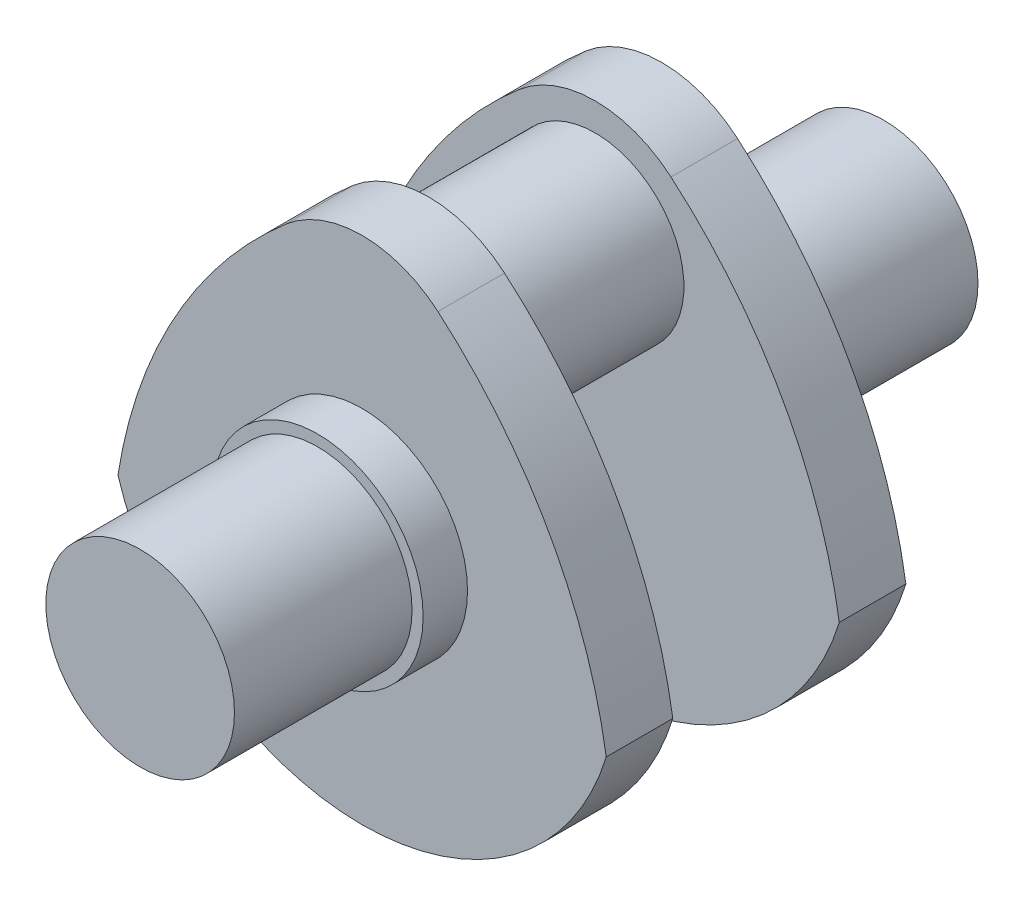
ISO-10303-21;
HEADER;
FILE_DESCRIPTION(('STEP AP214'),'2;1');
FILE_NAME('part.step','',(''),(''),'','','');
FILE_SCHEMA(('AUTOMOTIVE_DESIGN { 1 0 10303 214 1 1 1 1 }'));
ENDSEC;
DATA;
#1=APPLICATION_CONTEXT('core data for automotive mechanical design processes');
#2=APPLICATION_PROTOCOL_DEFINITION('international standard','automotive_design',2000,#1);
#3=PRODUCT_CONTEXT('',#1,'mechanical');
#4=PRODUCT('Part','Part','',(#3));
#5=PRODUCT_RELATED_PRODUCT_CATEGORY('part','',(#4));
#6=PRODUCT_DEFINITION_FORMATION('','',#4);
#7=PRODUCT_DEFINITION_CONTEXT('part definition',#1,'design');
#8=PRODUCT_DEFINITION('design','',#6,#7);
#9=PRODUCT_DEFINITION_SHAPE('','',#8);
#10=(LENGTH_UNIT() NAMED_UNIT(*) SI_UNIT(.MILLI.,.METRE.));
#11=(NAMED_UNIT(*) PLANE_ANGLE_UNIT() SI_UNIT($,.RADIAN.));
#12=(NAMED_UNIT(*) SI_UNIT($,.STERADIAN.) SOLID_ANGLE_UNIT());
#13=UNCERTAINTY_MEASURE_WITH_UNIT(LENGTH_MEASURE(1.E-05),#10,'distance_accuracy_value','');
#14=(GEOMETRIC_REPRESENTATION_CONTEXT(3) GLOBAL_UNCERTAINTY_ASSIGNED_CONTEXT((#13)) GLOBAL_UNIT_ASSIGNED_CONTEXT((#10,
#11,#12)) REPRESENTATION_CONTEXT('',''));
#15=CARTESIAN_POINT('',(0.,0.,0.));
#16=DIRECTION('',(0.,0.,1.));
#17=DIRECTION('',(1.,0.,0.));
#18=AXIS2_PLACEMENT_3D('',#15,#16,#17);
#19=CARTESIAN_POINT('',(0.,0.,40.));
#20=DIRECTION('',(0.,0.,-1.));
#21=DIRECTION('',(-1.,0.,0.));
#22=AXIS2_PLACEMENT_3D('',#19,#20,#21);
#23=CYLINDRICAL_SURFACE('',#22,17.);
#24=CARTESIAN_POINT('',(0.,0.,0.));
#25=DIRECTION('',(0.,0.,1.));
#26=DIRECTION('',(1.,0.,0.));
#27=AXIS2_PLACEMENT_3D('',#24,#25,#26);
#28=CIRCLE('',#27,17.);
#29=CARTESIAN_POINT('',(17.,0.,0.));
#30=VERTEX_POINT('',#29);
#31=EDGE_CURVE('E191',#30,#30,#28,.T.);
#32=ORIENTED_EDGE('',*,*,#31,.T.);
#33=EDGE_LOOP('',(#32));
#34=FACE_BOUND('',#33,.T.);
#35=CARTESIAN_POINT('',(0.,0.,32.));
#36=DIRECTION('',(0.,0.,1.));
#37=DIRECTION('',(1.,0.,0.));
#38=AXIS2_PLACEMENT_3D('',#35,#36,#37);
#39=CIRCLE('',#38,17.);
#40=CARTESIAN_POINT('',(17.,0.,32.));
#41=VERTEX_POINT('',#40);
#42=EDGE_CURVE('E41',#41,#41,#39,.T.);
#43=ORIENTED_EDGE('',*,*,#42,.F.);
#44=EDGE_LOOP('',(#43));
#45=FACE_BOUND('',#44,.T.);
#46=ADVANCED_FACE('F33',(#34,#45),#23,.T.);
#47=CARTESIAN_POINT('',(0.,0.,0.));
#48=DIRECTION('',(0.,0.,1.));
#49=DIRECTION('',(1.,0.,0.));
#50=AXIS2_PLACEMENT_3D('',#47,#48,#49);
#51=PLANE('',#50);
#52=ORIENTED_EDGE('',*,*,#31,.F.);
#53=EDGE_LOOP('',(#52));
#54=FACE_BOUND('',#53,.T.);
#55=ADVANCED_FACE('F202',(#54),#51,.F.);
#56=CARTESIAN_POINT('',(0.,0.,32.));
#57=DIRECTION('',(0.,0.,1.));
#58=DIRECTION('',(1.,0.,0.));
#59=AXIS2_PLACEMENT_3D('',#56,#57,#58);
#60=CYLINDRICAL_SURFACE('',#59,19.);
#61=CARTESIAN_POINT('',(0.,0.,32.));
#62=DIRECTION('',(0.,0.,1.));
#63=DIRECTION('',(1.,0.,0.));
#64=AXIS2_PLACEMENT_3D('',#61,#62,#63);
#65=CIRCLE('',#64,19.);
#66=CARTESIAN_POINT('',(19.,0.,32.));
#67=VERTEX_POINT('',#66);
#68=EDGE_CURVE('E188',#67,#67,#65,.T.);
#69=ORIENTED_EDGE('',*,*,#68,.T.);
#70=EDGE_LOOP('',(#69));
#71=FACE_BOUND('',#70,.T.);
#72=CARTESIAN_POINT('',(0.,0.,40.));
#73=DIRECTION('',(0.,0.,1.));
#74=DIRECTION('',(1.,0.,0.));
#75=AXIS2_PLACEMENT_3D('',#72,#73,#74);
#76=CIRCLE('',#75,19.);
#77=CARTESIAN_POINT('',(19.,0.,40.));
#78=VERTEX_POINT('',#77);
#79=EDGE_CURVE('E187',#78,#78,#76,.T.);
#80=ORIENTED_EDGE('',*,*,#79,.F.);
#81=EDGE_LOOP('',(#80));
#82=FACE_BOUND('',#81,.T.);
#83=ADVANCED_FACE('F207',(#71,#82),#60,.T.);
#84=CARTESIAN_POINT('',(0.,0.,32.));
#85=DIRECTION('',(0.,0.,1.));
#86=DIRECTION('',(1.,0.,0.));
#87=AXIS2_PLACEMENT_3D('',#84,#85,#86);
#88=PLANE('',#87);
#89=ORIENTED_EDGE('',*,*,#42,.T.);
#90=EDGE_LOOP('',(#89));
#91=FACE_BOUND('',#90,.T.);
#92=ORIENTED_EDGE('',*,*,#68,.F.);
#93=EDGE_LOOP('',(#92));
#94=FACE_BOUND('',#93,.T.);
#95=ADVANCED_FACE('F198',(#91,#94),#88,.F.);
#96=CARTESIAN_POINT('',(44.9094542035734,-27.3845485151599,52.));
#97=DIRECTION('',(0.,0.,-1.));
#98=DIRECTION('',(-1.,0.,0.));
#99=AXIS2_PLACEMENT_3D('',#96,#97,#98);
#100=CYLINDRICAL_SURFACE('',#99,90.);
#101=CARTESIAN_POINT('',(44.9094542035734,-27.3845485151599,40.));
#102=DIRECTION('',(0.,0.,1.));
#103=DIRECTION('',(-1.,0.,0.));
#104=AXIS2_PLACEMENT_3D('',#101,#102,#103);
#105=CIRCLE('',#104,90.);
#106=CARTESIAN_POINT('',(-13.6680947576093,40.9431234611356,40.));
#107=VERTEX_POINT('',#106);
#108=CARTESIAN_POINT('',(-44.,-13.4164078649987,40.));
#109=VERTEX_POINT('',#108);
#110=EDGE_CURVE('E166',#107,#109,#105,.T.);
#111=ORIENTED_EDGE('',*,*,#110,.T.);
#112=DIRECTION('',(0.,0.,-1.));
#113=VECTOR('',#112,1.);
#114=CARTESIAN_POINT('',(-44.,-13.4164078649987,52.));
#115=LINE('',#114,#113);
#116=CARTESIAN_POINT('',(-44.,-13.4164078649987,52.));
#117=VERTEX_POINT('',#116);
#118=EDGE_CURVE('E185',#117,#109,#115,.T.);
#119=ORIENTED_EDGE('',*,*,#118,.F.);
#120=CARTESIAN_POINT('',(44.9094542035734,-27.3845485151599,52.));
#121=DIRECTION('',(0.,0.,1.));
#122=DIRECTION('',(-1.,0.,0.));
#123=AXIS2_PLACEMENT_3D('',#120,#121,#122);
#124=CIRCLE('',#123,90.);
#125=CARTESIAN_POINT('',(-13.6680947576093,40.9431234611356,52.));
#126=VERTEX_POINT('',#125);
#127=EDGE_CURVE('E167',#126,#117,#124,.T.);
#128=ORIENTED_EDGE('',*,*,#127,.F.);
#129=DIRECTION('',(0.,0.,-1.));
#130=VECTOR('',#129,1.);
#131=CARTESIAN_POINT('',(-13.6680947576093,40.9431234611356,52.));
#132=LINE('',#131,#130);
#133=EDGE_CURVE('E173',#126,#107,#132,.T.);
#134=ORIENTED_EDGE('',*,*,#133,.T.);
#135=EDGE_LOOP('',(#111,#119,#128,#134));
#136=FACE_BOUND('',#135,.T.);
#137=ADVANCED_FACE('F218',(#136),#100,.T.);
#138=CARTESIAN_POINT('',(0.,0.,52.));
#139=DIRECTION('',(0.,0.,-1.));
#140=DIRECTION('',(-1.,0.,0.));
#141=AXIS2_PLACEMENT_3D('',#138,#139,#140);
#142=CYLINDRICAL_SURFACE('',#141,46.);
#143=CARTESIAN_POINT('',(0.,0.,40.));
#144=DIRECTION('',(0.,0.,1.));
#145=DIRECTION('',(1.,0.,0.));
#146=AXIS2_PLACEMENT_3D('',#143,#144,#145);
#147=CIRCLE('',#146,46.);
#148=CARTESIAN_POINT('',(44.,-13.4164078649987,40.));
#149=VERTEX_POINT('',#148);
#150=EDGE_CURVE('E176',#109,#149,#147,.T.);
#151=ORIENTED_EDGE('',*,*,#150,.T.);
#152=DIRECTION('',(0.,0.,-1.));
#153=VECTOR('',#152,1.);
#154=CARTESIAN_POINT('',(44.,-13.4164078649987,52.));
#155=LINE('',#154,#153);
#156=CARTESIAN_POINT('',(44.,-13.4164078649987,52.));
#157=VERTEX_POINT('',#156);
#158=EDGE_CURVE('E183',#157,#149,#155,.T.);
#159=ORIENTED_EDGE('',*,*,#158,.F.);
#160=CARTESIAN_POINT('',(0.,0.,52.));
#161=DIRECTION('',(0.,0.,1.));
#162=DIRECTION('',(1.,0.,0.));
#163=AXIS2_PLACEMENT_3D('',#160,#161,#162);
#164=CIRCLE('',#163,46.);
#165=EDGE_CURVE('E81',#117,#157,#164,.T.);
#166=ORIENTED_EDGE('',*,*,#165,.F.);
#167=ORIENTED_EDGE('',*,*,#118,.T.);
#168=EDGE_LOOP('',(#151,#159,#166,#167));
#169=FACE_BOUND('',#168,.T.);
#170=ADVANCED_FACE('F221',(#169),#142,.T.);
#171=CARTESIAN_POINT('',(-44.9094542035734,-27.3845485151599,52.));
#172=DIRECTION('',(0.,0.,-1.));
#173=DIRECTION('',(-1.,0.,0.));
#174=AXIS2_PLACEMENT_3D('',#171,#172,#173);
#175=CYLINDRICAL_SURFACE('',#174,90.);
#176=CARTESIAN_POINT('',(-44.9094542035734,-27.3845485151599,40.));
#177=DIRECTION('',(0.,0.,1.));
#178=DIRECTION('',(1.,0.,0.));
#179=AXIS2_PLACEMENT_3D('',#176,#177,#178);
#180=CIRCLE('',#179,90.);
#181=CARTESIAN_POINT('',(13.6680947576093,40.9431234611356,40.));
#182=VERTEX_POINT('',#181);
#183=EDGE_CURVE('E67',#149,#182,#180,.T.);
#184=ORIENTED_EDGE('',*,*,#183,.T.);
#185=DIRECTION('',(0.,0.,-1.));
#186=VECTOR('',#185,1.);
#187=CARTESIAN_POINT('',(13.6680947576093,40.9431234611356,52.));
#188=LINE('',#187,#186);
#189=CARTESIAN_POINT('',(13.6680947576093,40.9431234611356,52.));
#190=VERTEX_POINT('',#189);
#191=EDGE_CURVE('E181',#190,#182,#188,.T.);
#192=ORIENTED_EDGE('',*,*,#191,.F.);
#193=CARTESIAN_POINT('',(-44.9094542035734,-27.3845485151599,52.));
#194=DIRECTION('',(0.,0.,1.));
#195=DIRECTION('',(1.,0.,0.));
#196=AXIS2_PLACEMENT_3D('',#193,#194,#195);
#197=CIRCLE('',#196,90.);
#198=EDGE_CURVE('E170',#157,#190,#197,.T.);
#199=ORIENTED_EDGE('',*,*,#198,.F.);
#200=ORIENTED_EDGE('',*,*,#158,.T.);
#201=EDGE_LOOP('',(#184,#192,#199,#200));
#202=FACE_BOUND('',#201,.T.);
#203=ADVANCED_FACE('F225',(#202),#175,.T.);
#204=CARTESIAN_POINT('',(0.,25.,52.));
#205=DIRECTION('',(0.,0.,-1.));
#206=DIRECTION('',(-1.,0.,0.));
#207=AXIS2_PLACEMENT_3D('',#204,#205,#206);
#208=CYLINDRICAL_SURFACE('',#207,21.);
#209=CARTESIAN_POINT('',(0.,25.,40.));
#210=DIRECTION('',(0.,0.,1.));
#211=DIRECTION('',(1.,0.,0.));
#212=AXIS2_PLACEMENT_3D('',#209,#210,#211);
#213=CIRCLE('',#212,21.);
#214=EDGE_CURVE('E73',#182,#107,#213,.T.);
#215=ORIENTED_EDGE('',*,*,#214,.T.);
#216=ORIENTED_EDGE('',*,*,#133,.F.);
#217=CARTESIAN_POINT('',(0.,25.,52.));
#218=DIRECTION('',(0.,0.,1.));
#219=DIRECTION('',(1.,0.,0.));
#220=AXIS2_PLACEMENT_3D('',#217,#218,#219);
#221=CIRCLE('',#220,21.);
#222=EDGE_CURVE('E49',#190,#126,#221,.T.);
#223=ORIENTED_EDGE('',*,*,#222,.F.);
#224=ORIENTED_EDGE('',*,*,#191,.T.);
#225=EDGE_LOOP('',(#215,#216,#223,#224));
#226=FACE_BOUND('',#225,.T.);
#227=ADVANCED_FACE('F228',(#226),#208,.T.);
#228=CARTESIAN_POINT('',(22.4547271017867,-1.19227425757995,52.));
#229=DIRECTION('',(0.,0.,-1.));
#230=DIRECTION('',(-1.,0.,0.));
#231=AXIS2_PLACEMENT_3D('',#228,#229,#230);
#232=PLANE('',#231);
#233=CARTESIAN_POINT('',(0.,25.,52.));
#234=DIRECTION('',(0.,0.,-1.));
#235=DIRECTION('',(-1.,0.,0.));
#236=AXIS2_PLACEMENT_3D('',#233,#234,#235);
#237=CIRCLE('',#236,16.);
#238=CARTESIAN_POINT('',(-16.,25.,52.));
#239=VERTEX_POINT('',#238);
#240=EDGE_CURVE('E11',#239,#239,#237,.F.);
#241=ORIENTED_EDGE('',*,*,#240,.F.);
#242=EDGE_LOOP('',(#241));
#243=FACE_BOUND('',#242,.T.);
#244=ORIENTED_EDGE('',*,*,#127,.T.);
#245=ORIENTED_EDGE('',*,*,#165,.T.);
#246=ORIENTED_EDGE('',*,*,#198,.T.);
#247=ORIENTED_EDGE('',*,*,#222,.T.);
#248=EDGE_LOOP('',(#244,#245,#246,#247));
#249=FACE_BOUND('',#248,.T.);
#250=ADVANCED_FACE('F231',(#243,#249),#232,.F.);
#251=CARTESIAN_POINT('',(22.4547271017867,-1.19227425757995,40.));
#252=DIRECTION('',(0.,0.,-1.));
#253=DIRECTION('',(-1.,0.,0.));
#254=AXIS2_PLACEMENT_3D('',#251,#252,#253);
#255=PLANE('',#254);
#256=ORIENTED_EDGE('',*,*,#79,.T.);
#257=EDGE_LOOP('',(#256));
#258=FACE_BOUND('',#257,.T.);
#259=ORIENTED_EDGE('',*,*,#110,.F.);
#260=ORIENTED_EDGE('',*,*,#214,.F.);
#261=ORIENTED_EDGE('',*,*,#183,.F.);
#262=ORIENTED_EDGE('',*,*,#150,.F.);
#263=EDGE_LOOP('',(#259,#260,#261,#262));
#264=FACE_BOUND('',#263,.T.);
#265=ADVANCED_FACE('F232',(#258,#264),#255,.T.);
#266=CARTESIAN_POINT('',(0.,25.,67.));
#267=DIRECTION('',(0.,0.,-1.));
#268=DIRECTION('',(-1.,0.,0.));
#269=AXIS2_PLACEMENT_3D('',#266,#267,#268);
#270=CYLINDRICAL_SURFACE('',#269,16.);
#271=ORIENTED_EDGE('',*,*,#240,.T.);
#272=EDGE_LOOP('',(#271));
#273=FACE_BOUND('',#272,.T.);
#274=CARTESIAN_POINT('',(0.,25.,82.));
#275=DIRECTION('',(0.,0.,-1.));
#276=DIRECTION('',(-1.,0.,0.));
#277=AXIS2_PLACEMENT_3D('',#274,#275,#276);
#278=CIRCLE('',#277,16.);
#279=CARTESIAN_POINT('',(-16.,25.,82.));
#280=VERTEX_POINT('',#279);
#281=EDGE_CURVE('E163',#280,#280,#278,.F.);
#282=ORIENTED_EDGE('',*,*,#281,.F.);
#283=EDGE_LOOP('',(#282));
#284=FACE_BOUND('',#283,.T.);
#285=ADVANCED_FACE('F235',(#273,#284),#270,.T.);
#286=CARTESIAN_POINT('',(0.,0.,94.));
#287=DIRECTION('',(0.,0.,1.));
#288=DIRECTION('',(-1.,0.,0.));
#289=AXIS2_PLACEMENT_3D('',#286,#287,#288);
#290=CYLINDRICAL_SURFACE('',#289,17.);
#291=CARTESIAN_POINT('',(0.,0.,134.));
#292=DIRECTION('',(0.,0.,1.));
#293=DIRECTION('',(1.,0.,0.));
#294=AXIS2_PLACEMENT_3D('',#291,#292,#293);
#295=CIRCLE('',#294,17.);
#296=CARTESIAN_POINT('',(17.,0.,134.));
#297=VERTEX_POINT('',#296);
#298=EDGE_CURVE('E155',#297,#297,#295,.T.);
#299=ORIENTED_EDGE('',*,*,#298,.F.);
#300=EDGE_LOOP('',(#299));
#301=FACE_BOUND('',#300,.T.);
#302=CARTESIAN_POINT('',(0.,0.,102.));
#303=DIRECTION('',(0.,0.,1.));
#304=DIRECTION('',(1.,0.,0.));
#305=AXIS2_PLACEMENT_3D('',#302,#303,#304);
#306=CIRCLE('',#305,17.);
#307=CARTESIAN_POINT('',(17.,0.,102.));
#308=VERTEX_POINT('',#307);
#309=EDGE_CURVE('E160',#308,#308,#306,.T.);
#310=ORIENTED_EDGE('',*,*,#309,.T.);
#311=EDGE_LOOP('',(#310));
#312=FACE_BOUND('',#311,.T.);
#313=ADVANCED_FACE('F242',(#301,#312),#290,.T.);
#314=CARTESIAN_POINT('',(0.,0.,134.));
#315=DIRECTION('',(0.,0.,-1.));
#316=DIRECTION('',(1.,0.,0.));
#317=AXIS2_PLACEMENT_3D('',#314,#315,#316);
#318=PLANE('',#317);
#319=ORIENTED_EDGE('',*,*,#298,.T.);
#320=EDGE_LOOP('',(#319));
#321=FACE_BOUND('',#320,.T.);
#322=ADVANCED_FACE('F246',(#321),#318,.F.);
#323=CARTESIAN_POINT('',(0.,0.,102.));
#324=DIRECTION('',(0.,0.,-1.));
#325=DIRECTION('',(1.,0.,0.));
#326=AXIS2_PLACEMENT_3D('',#323,#324,#325);
#327=CYLINDRICAL_SURFACE('',#326,19.);
#328=CARTESIAN_POINT('',(0.,0.,102.));
#329=DIRECTION('',(0.,0.,1.));
#330=DIRECTION('',(1.,0.,0.));
#331=AXIS2_PLACEMENT_3D('',#328,#329,#330);
#332=CIRCLE('',#331,19.);
#333=CARTESIAN_POINT('',(19.,0.,102.));
#334=VERTEX_POINT('',#333);
#335=EDGE_CURVE('E152',#334,#334,#332,.T.);
#336=ORIENTED_EDGE('',*,*,#335,.F.);
#337=EDGE_LOOP('',(#336));
#338=FACE_BOUND('',#337,.T.);
#339=CARTESIAN_POINT('',(0.,0.,94.));
#340=DIRECTION('',(0.,0.,1.));
#341=DIRECTION('',(1.,0.,0.));
#342=AXIS2_PLACEMENT_3D('',#339,#340,#341);
#343=CIRCLE('',#342,19.);
#344=CARTESIAN_POINT('',(19.,0.,94.));
#345=VERTEX_POINT('',#344);
#346=EDGE_CURVE('E128',#345,#345,#343,.T.);
#347=ORIENTED_EDGE('',*,*,#346,.T.);
#348=EDGE_LOOP('',(#347));
#349=FACE_BOUND('',#348,.T.);
#350=ADVANCED_FACE('F250',(#338,#349),#327,.T.);
#351=CARTESIAN_POINT('',(0.,0.,102.));
#352=DIRECTION('',(0.,0.,-1.));
#353=DIRECTION('',(1.,0.,0.));
#354=AXIS2_PLACEMENT_3D('',#351,#352,#353);
#355=PLANE('',#354);
#356=ORIENTED_EDGE('',*,*,#309,.F.);
#357=EDGE_LOOP('',(#356));
#358=FACE_BOUND('',#357,.T.);
#359=ORIENTED_EDGE('',*,*,#335,.T.);
#360=EDGE_LOOP('',(#359));
#361=FACE_BOUND('',#360,.T.);
#362=ADVANCED_FACE('F254',(#358,#361),#355,.F.);
#363=CARTESIAN_POINT('',(44.9094542035734,-27.3845485151599,82.));
#364=DIRECTION('',(0.,0.,1.));
#365=DIRECTION('',(-1.,0.,0.));
#366=AXIS2_PLACEMENT_3D('',#363,#364,#365);
#367=CYLINDRICAL_SURFACE('',#366,90.);
#368=CARTESIAN_POINT('',(44.9094542035734,-27.3845485151599,94.));
#369=DIRECTION('',(0.,0.,1.));
#370=DIRECTION('',(-1.,0.,0.));
#371=AXIS2_PLACEMENT_3D('',#368,#369,#370);
#372=CIRCLE('',#371,90.);
#373=CARTESIAN_POINT('',(-13.6680947576093,40.9431234611356,94.));
#374=VERTEX_POINT('',#373);
#375=CARTESIAN_POINT('',(-44.,-13.4164078649987,94.));
#376=VERTEX_POINT('',#375);
#377=EDGE_CURVE('E142',#374,#376,#372,.T.);
#378=ORIENTED_EDGE('',*,*,#377,.F.);
#379=DIRECTION('',(0.,0.,1.));
#380=VECTOR('',#379,1.);
#381=CARTESIAN_POINT('',(-13.6680947576093,40.9431234611356,82.));
#382=LINE('',#381,#380);
#383=CARTESIAN_POINT('',(-13.6680947576093,40.9431234611356,82.));
#384=VERTEX_POINT('',#383);
#385=EDGE_CURVE('E133',#384,#374,#382,.T.);
#386=ORIENTED_EDGE('',*,*,#385,.F.);
#387=CARTESIAN_POINT('',(44.9094542035734,-27.3845485151599,82.));
#388=DIRECTION('',(0.,0.,1.));
#389=DIRECTION('',(-1.,0.,0.));
#390=AXIS2_PLACEMENT_3D('',#387,#388,#389);
#391=CIRCLE('',#390,90.);
#392=CARTESIAN_POINT('',(-44.,-13.4164078649987,82.));
#393=VERTEX_POINT('',#392);
#394=EDGE_CURVE('E112',#384,#393,#391,.T.);
#395=ORIENTED_EDGE('',*,*,#394,.T.);
#396=DIRECTION('',(0.,0.,1.));
#397=VECTOR('',#396,1.);
#398=CARTESIAN_POINT('',(-44.,-13.4164078649987,82.));
#399=LINE('',#398,#397);
#400=EDGE_CURVE('E121',#393,#376,#399,.T.);
#401=ORIENTED_EDGE('',*,*,#400,.T.);
#402=EDGE_LOOP('',(#378,#386,#395,#401));
#403=FACE_BOUND('',#402,.T.);
#404=ADVANCED_FACE('F131',(#403),#367,.T.);
#405=CARTESIAN_POINT('',(0.,0.,82.));
#406=DIRECTION('',(0.,0.,1.));
#407=DIRECTION('',(-1.,0.,0.));
#408=AXIS2_PLACEMENT_3D('',#405,#406,#407);
#409=CYLINDRICAL_SURFACE('',#408,46.);
#410=CARTESIAN_POINT('',(0.,0.,94.));
#411=DIRECTION('',(0.,0.,1.));
#412=DIRECTION('',(1.,0.,0.));
#413=AXIS2_PLACEMENT_3D('',#410,#411,#412);
#414=CIRCLE('',#413,46.);
#415=CARTESIAN_POINT('',(44.,-13.4164078649987,94.));
#416=VERTEX_POINT('',#415);
#417=EDGE_CURVE('E124',#376,#416,#414,.T.);
#418=ORIENTED_EDGE('',*,*,#417,.F.);
#419=ORIENTED_EDGE('',*,*,#400,.F.);
#420=CARTESIAN_POINT('',(0.,0.,82.));
#421=DIRECTION('',(0.,0.,1.));
#422=DIRECTION('',(1.,0.,0.));
#423=AXIS2_PLACEMENT_3D('',#420,#421,#422);
#424=CIRCLE('',#423,46.);
#425=CARTESIAN_POINT('',(44.,-13.4164078649987,82.));
#426=VERTEX_POINT('',#425);
#427=EDGE_CURVE('E108',#393,#426,#424,.T.);
#428=ORIENTED_EDGE('',*,*,#427,.T.);
#429=DIRECTION('',(0.,0.,1.));
#430=VECTOR('',#429,1.);
#431=CARTESIAN_POINT('',(44.,-13.4164078649987,82.));
#432=LINE('',#431,#430);
#433=EDGE_CURVE('E129',#426,#416,#432,.T.);
#434=ORIENTED_EDGE('',*,*,#433,.T.);
#435=EDGE_LOOP('',(#418,#419,#428,#434));
#436=FACE_BOUND('',#435,.T.);
#437=ADVANCED_FACE('F122',(#436),#409,.T.);
#438=CARTESIAN_POINT('',(-44.9094542035734,-27.3845485151599,82.));
#439=DIRECTION('',(0.,0.,1.));
#440=DIRECTION('',(-1.,0.,0.));
#441=AXIS2_PLACEMENT_3D('',#438,#439,#440);
#442=CYLINDRICAL_SURFACE('',#441,90.);
#443=CARTESIAN_POINT('',(-44.9094542035734,-27.3845485151599,94.));
#444=DIRECTION('',(0.,0.,1.));
#445=DIRECTION('',(1.,0.,0.));
#446=AXIS2_PLACEMENT_3D('',#443,#444,#445);
#447=CIRCLE('',#446,90.);
#448=CARTESIAN_POINT('',(13.6680947576093,40.9431234611356,94.));
#449=VERTEX_POINT('',#448);
#450=EDGE_CURVE('E136',#416,#449,#447,.T.);
#451=ORIENTED_EDGE('',*,*,#450,.F.);
#452=ORIENTED_EDGE('',*,*,#433,.F.);
#453=CARTESIAN_POINT('',(-44.9094542035734,-27.3845485151599,82.));
#454=DIRECTION('',(0.,0.,1.));
#455=DIRECTION('',(1.,0.,0.));
#456=AXIS2_PLACEMENT_3D('',#453,#454,#455);
#457=CIRCLE('',#456,90.);
#458=CARTESIAN_POINT('',(13.6680947576093,40.9431234611356,82.));
#459=VERTEX_POINT('',#458);
#460=EDGE_CURVE('E115',#426,#459,#457,.T.);
#461=ORIENTED_EDGE('',*,*,#460,.T.);
#462=DIRECTION('',(0.,0.,1.));
#463=VECTOR('',#462,1.);
#464=CARTESIAN_POINT('',(13.6680947576093,40.9431234611356,82.));
#465=LINE('',#464,#463);
#466=EDGE_CURVE('E148',#459,#449,#465,.T.);
#467=ORIENTED_EDGE('',*,*,#466,.T.);
#468=EDGE_LOOP('',(#451,#452,#461,#467));
#469=FACE_BOUND('',#468,.T.);
#470=ADVANCED_FACE('F263',(#469),#442,.T.);
#471=CARTESIAN_POINT('',(0.,25.,82.));
#472=DIRECTION('',(0.,0.,1.));
#473=DIRECTION('',(-1.,0.,0.));
#474=AXIS2_PLACEMENT_3D('',#471,#472,#473);
#475=CYLINDRICAL_SURFACE('',#474,21.);
#476=CARTESIAN_POINT('',(0.,25.,94.));
#477=DIRECTION('',(0.,0.,1.));
#478=DIRECTION('',(1.,0.,0.));
#479=AXIS2_PLACEMENT_3D('',#476,#477,#478);
#480=CIRCLE('',#479,21.);
#481=EDGE_CURVE('E134',#449,#374,#480,.T.);
#482=ORIENTED_EDGE('',*,*,#481,.F.);
#483=ORIENTED_EDGE('',*,*,#466,.F.);
#484=CARTESIAN_POINT('',(0.,25.,82.));
#485=DIRECTION('',(0.,0.,1.));
#486=DIRECTION('',(1.,0.,0.));
#487=AXIS2_PLACEMENT_3D('',#484,#485,#486);
#488=CIRCLE('',#487,21.);
#489=EDGE_CURVE('E140',#459,#384,#488,.T.);
#490=ORIENTED_EDGE('',*,*,#489,.T.);
#491=ORIENTED_EDGE('',*,*,#385,.T.);
#492=EDGE_LOOP('',(#482,#483,#490,#491));
#493=FACE_BOUND('',#492,.T.);
#494=ADVANCED_FACE('F266',(#493),#475,.T.);
#495=CARTESIAN_POINT('',(22.4547271017867,-1.19227425757995,82.));
#496=DIRECTION('',(0.,0.,1.));
#497=DIRECTION('',(-1.,0.,0.));
#498=AXIS2_PLACEMENT_3D('',#495,#496,#497);
#499=PLANE('',#498);
#500=ORIENTED_EDGE('',*,*,#281,.T.);
#501=EDGE_LOOP('',(#500));
#502=FACE_BOUND('',#501,.T.);
#503=ORIENTED_EDGE('',*,*,#394,.F.);
#504=ORIENTED_EDGE('',*,*,#489,.F.);
#505=ORIENTED_EDGE('',*,*,#460,.F.);
#506=ORIENTED_EDGE('',*,*,#427,.F.);
#507=EDGE_LOOP('',(#503,#504,#505,#506));
#508=FACE_BOUND('',#507,.T.);
#509=ADVANCED_FACE('F110',(#502,#508),#499,.F.);
#510=CARTESIAN_POINT('',(22.4547271017867,-1.19227425757995,94.));
#511=DIRECTION('',(0.,0.,1.));
#512=DIRECTION('',(-1.,0.,0.));
#513=AXIS2_PLACEMENT_3D('',#510,#511,#512);
#514=PLANE('',#513);
#515=ORIENTED_EDGE('',*,*,#346,.F.);
#516=EDGE_LOOP('',(#515));
#517=FACE_BOUND('',#516,.T.);
#518=ORIENTED_EDGE('',*,*,#377,.T.);
#519=ORIENTED_EDGE('',*,*,#417,.T.);
#520=ORIENTED_EDGE('',*,*,#450,.T.);
#521=ORIENTED_EDGE('',*,*,#481,.T.);
#522=EDGE_LOOP('',(#518,#519,#520,#521));
#523=FACE_BOUND('',#522,.T.);
#524=ADVANCED_FACE('F271',(#517,#523),#514,.T.);
#525=CLOSED_SHELL('',(#46,#55,#83,#95,#137,#170,#203,#227,#250,#265,#285,#313,#322,#350,#362,
#404,#437,#470,#494,#509,#524));
#526=MANIFOLD_SOLID_BREP('B2',#525);
#527=ADVANCED_BREP_SHAPE_REPRESENTATION('',(#18,#526),#14);
#528=SHAPE_DEFINITION_REPRESENTATION(#9,#527);
ENDSEC;
END-ISO-10303-21;
